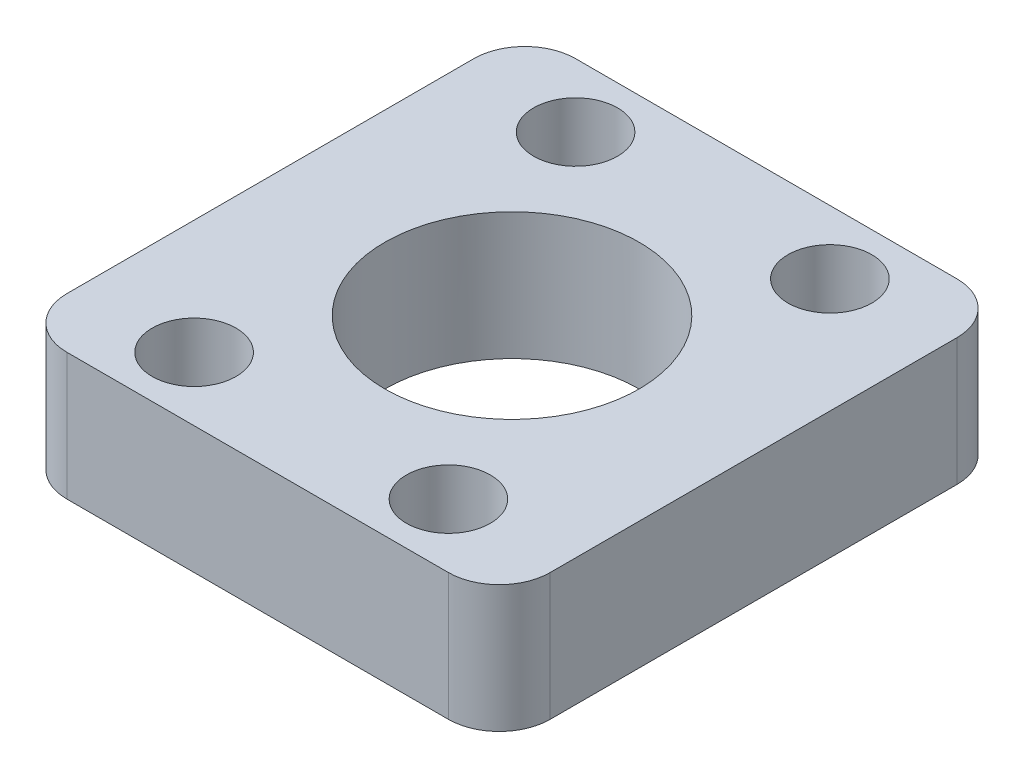
ISO-10303-21;
HEADER;
FILE_DESCRIPTION(('STEP AP214'),'2;1');
FILE_NAME('part.step','',(''),(''),'','','');
FILE_SCHEMA(('AUTOMOTIVE_DESIGN { 1 0 10303 214 1 1 1 1 }'));
ENDSEC;
DATA;
#1=APPLICATION_CONTEXT('core data for automotive mechanical design processes');
#2=APPLICATION_PROTOCOL_DEFINITION('international standard','automotive_design',2000,#1);
#3=PRODUCT_CONTEXT('',#1,'mechanical');
#4=PRODUCT('Part','Part','',(#3));
#5=PRODUCT_RELATED_PRODUCT_CATEGORY('part','',(#4));
#6=PRODUCT_DEFINITION_FORMATION('','',#4);
#7=PRODUCT_DEFINITION_CONTEXT('part definition',#1,'design');
#8=PRODUCT_DEFINITION('design','',#6,#7);
#9=PRODUCT_DEFINITION_SHAPE('','',#8);
#10=(LENGTH_UNIT() NAMED_UNIT(*) SI_UNIT(.MILLI.,.METRE.));
#11=(NAMED_UNIT(*) PLANE_ANGLE_UNIT() SI_UNIT($,.RADIAN.));
#12=(NAMED_UNIT(*) SI_UNIT($,.STERADIAN.) SOLID_ANGLE_UNIT());
#13=UNCERTAINTY_MEASURE_WITH_UNIT(LENGTH_MEASURE(1.E-05),#10,'distance_accuracy_value','');
#14=(GEOMETRIC_REPRESENTATION_CONTEXT(3) GLOBAL_UNCERTAINTY_ASSIGNED_CONTEXT((#13)) GLOBAL_UNIT_ASSIGNED_CONTEXT((#10,
#11,#12)) REPRESENTATION_CONTEXT('',''));
#15=CARTESIAN_POINT('',(0.,0.,0.));
#16=DIRECTION('',(0.,0.,1.));
#17=DIRECTION('',(1.,0.,0.));
#18=AXIS2_PLACEMENT_3D('',#15,#16,#17);
#19=CARTESIAN_POINT('',(9.5,5.,10.));
#20=DIRECTION('',(-1.,0.,0.));
#21=DIRECTION('',(0.,0.,1.));
#22=AXIS2_PLACEMENT_3D('',#19,#20,#21);
#23=PLANE('',#22);
#24=DIRECTION('',(0.,0.,-1.));
#25=VECTOR('',#24,1.);
#26=CARTESIAN_POINT('',(9.5,0.,10.));
#27=LINE('',#26,#25);
#28=CARTESIAN_POINT('',(9.5,0.,8.));
#29=VERTEX_POINT('',#28);
#30=CARTESIAN_POINT('',(9.5,0.,-8.));
#31=VERTEX_POINT('',#30);
#32=EDGE_CURVE('E136',#29,#31,#27,.T.);
#33=ORIENTED_EDGE('',*,*,#32,.T.);
#34=DIRECTION('',(0.,-1.,0.));
#35=VECTOR('',#34,1.);
#36=CARTESIAN_POINT('',(9.5,5.,-8.));
#37=LINE('',#36,#35);
#38=CARTESIAN_POINT('',(9.5,5.,-8.));
#39=VERTEX_POINT('',#38);
#40=EDGE_CURVE('E114',#31,#39,#37,.F.);
#41=ORIENTED_EDGE('',*,*,#40,.T.);
#42=DIRECTION('',(0.,0.,-1.));
#43=VECTOR('',#42,1.);
#44=CARTESIAN_POINT('',(9.5,5.,10.));
#45=LINE('',#44,#43);
#46=CARTESIAN_POINT('',(9.5,5.,8.));
#47=VERTEX_POINT('',#46);
#48=EDGE_CURVE('E145',#47,#39,#45,.T.);
#49=ORIENTED_EDGE('',*,*,#48,.F.);
#50=DIRECTION('',(0.,-1.,0.));
#51=VECTOR('',#50,1.);
#52=CARTESIAN_POINT('',(9.5,5.,8.));
#53=LINE('',#52,#51);
#54=EDGE_CURVE('E119',#47,#29,#53,.T.);
#55=ORIENTED_EDGE('',*,*,#54,.T.);
#56=EDGE_LOOP('',(#33,#41,#49,#55));
#57=FACE_BOUND('',#56,.T.);
#58=ADVANCED_FACE('F42',(#57),#23,.F.);
#59=CARTESIAN_POINT('',(-9.5,5.,-10.));
#60=DIRECTION('',(0.,0.,1.));
#61=DIRECTION('',(1.,0.,0.));
#62=AXIS2_PLACEMENT_3D('',#59,#60,#61);
#63=PLANE('',#62);
#64=DIRECTION('',(-1.,0.,0.));
#65=VECTOR('',#64,1.);
#66=CARTESIAN_POINT('',(-9.5,5.,-10.));
#67=LINE('',#66,#65);
#68=CARTESIAN_POINT('',(7.5,5.,-10.));
#69=VERTEX_POINT('',#68);
#70=CARTESIAN_POINT('',(-7.5,5.,-10.));
#71=VERTEX_POINT('',#70);
#72=EDGE_CURVE('E129',#69,#71,#67,.T.);
#73=ORIENTED_EDGE('',*,*,#72,.F.);
#74=DIRECTION('',(0.,-1.,0.));
#75=VECTOR('',#74,1.);
#76=CARTESIAN_POINT('',(7.5,5.,-10.));
#77=LINE('',#76,#75);
#78=CARTESIAN_POINT('',(7.5,0.,-10.));
#79=VERTEX_POINT('',#78);
#80=EDGE_CURVE('E113',#69,#79,#77,.T.);
#81=ORIENTED_EDGE('',*,*,#80,.T.);
#82=DIRECTION('',(-1.,0.,0.));
#83=VECTOR('',#82,1.);
#84=CARTESIAN_POINT('',(-9.5,0.,-10.));
#85=LINE('',#84,#83);
#86=CARTESIAN_POINT('',(-7.5,0.,-10.));
#87=VERTEX_POINT('',#86);
#88=EDGE_CURVE('E126',#79,#87,#85,.T.);
#89=ORIENTED_EDGE('',*,*,#88,.T.);
#90=DIRECTION('',(0.,-1.,0.));
#91=VECTOR('',#90,1.);
#92=CARTESIAN_POINT('',(-7.5,5.,-10.));
#93=LINE('',#92,#91);
#94=EDGE_CURVE('E131',#87,#71,#93,.F.);
#95=ORIENTED_EDGE('',*,*,#94,.T.);
#96=EDGE_LOOP('',(#73,#81,#89,#95));
#97=FACE_BOUND('',#96,.T.);
#98=ADVANCED_FACE('F125',(#97),#63,.F.);
#99=CARTESIAN_POINT('',(-9.5,5.,10.));
#100=DIRECTION('',(1.,0.,0.));
#101=DIRECTION('',(0.,0.,-1.));
#102=AXIS2_PLACEMENT_3D('',#99,#100,#101);
#103=PLANE('',#102);
#104=DIRECTION('',(0.,0.,1.));
#105=VECTOR('',#104,1.);
#106=CARTESIAN_POINT('',(-9.5,0.,10.));
#107=LINE('',#106,#105);
#108=CARTESIAN_POINT('',(-9.5,0.,-8.));
#109=VERTEX_POINT('',#108);
#110=CARTESIAN_POINT('',(-9.5,0.,8.));
#111=VERTEX_POINT('',#110);
#112=EDGE_CURVE('E135',#109,#111,#107,.T.);
#113=ORIENTED_EDGE('',*,*,#112,.T.);
#114=DIRECTION('',(0.,-1.,0.));
#115=VECTOR('',#114,1.);
#116=CARTESIAN_POINT('',(-9.5,5.,8.));
#117=LINE('',#116,#115);
#118=CARTESIAN_POINT('',(-9.5,5.,8.));
#119=VERTEX_POINT('',#118);
#120=EDGE_CURVE('E12',#111,#119,#117,.F.);
#121=ORIENTED_EDGE('',*,*,#120,.T.);
#122=DIRECTION('',(0.,0.,1.));
#123=VECTOR('',#122,1.);
#124=CARTESIAN_POINT('',(-9.5,5.,10.));
#125=LINE('',#124,#123);
#126=CARTESIAN_POINT('',(-9.5,5.,-8.));
#127=VERTEX_POINT('',#126);
#128=EDGE_CURVE('E172',#127,#119,#125,.T.);
#129=ORIENTED_EDGE('',*,*,#128,.F.);
#130=DIRECTION('',(0.,-1.,0.));
#131=VECTOR('',#130,1.);
#132=CARTESIAN_POINT('',(-9.5,5.,-8.));
#133=LINE('',#132,#131);
#134=EDGE_CURVE('E51',#127,#109,#133,.T.);
#135=ORIENTED_EDGE('',*,*,#134,.T.);
#136=EDGE_LOOP('',(#113,#121,#129,#135));
#137=FACE_BOUND('',#136,.T.);
#138=ADVANCED_FACE('F170',(#137),#103,.F.);
#139=CARTESIAN_POINT('',(-9.5,5.,10.));
#140=DIRECTION('',(0.,0.,-1.));
#141=DIRECTION('',(-1.,0.,0.));
#142=AXIS2_PLACEMENT_3D('',#139,#140,#141);
#143=PLANE('',#142);
#144=DIRECTION('',(1.,0.,0.));
#145=VECTOR('',#144,1.);
#146=CARTESIAN_POINT('',(-9.5,0.,10.));
#147=LINE('',#146,#145);
#148=CARTESIAN_POINT('',(-7.5,0.,10.));
#149=VERTEX_POINT('',#148);
#150=CARTESIAN_POINT('',(7.5,0.,10.));
#151=VERTEX_POINT('',#150);
#152=EDGE_CURVE('E139',#149,#151,#147,.T.);
#153=ORIENTED_EDGE('',*,*,#152,.T.);
#154=DIRECTION('',(0.,-1.,0.));
#155=VECTOR('',#154,1.);
#156=CARTESIAN_POINT('',(7.5,5.,10.));
#157=LINE('',#156,#155);
#158=CARTESIAN_POINT('',(7.5,5.,10.));
#159=VERTEX_POINT('',#158);
#160=EDGE_CURVE('E58',#151,#159,#157,.F.);
#161=ORIENTED_EDGE('',*,*,#160,.T.);
#162=DIRECTION('',(1.,0.,0.));
#163=VECTOR('',#162,1.);
#164=CARTESIAN_POINT('',(-9.5,5.,10.));
#165=LINE('',#164,#163);
#166=CARTESIAN_POINT('',(-7.5,5.,10.));
#167=VERTEX_POINT('',#166);
#168=EDGE_CURVE('E146',#167,#159,#165,.T.);
#169=ORIENTED_EDGE('',*,*,#168,.F.);
#170=DIRECTION('',(0.,-1.,0.));
#171=VECTOR('',#170,1.);
#172=CARTESIAN_POINT('',(-7.5,5.,10.));
#173=LINE('',#172,#171);
#174=EDGE_CURVE('E162',#167,#149,#173,.T.);
#175=ORIENTED_EDGE('',*,*,#174,.T.);
#176=EDGE_LOOP('',(#153,#161,#169,#175));
#177=FACE_BOUND('',#176,.T.);
#178=ADVANCED_FACE('F179',(#177),#143,.F.);
#179=CARTESIAN_POINT('',(0.,5.,0.));
#180=DIRECTION('',(0.,-1.,0.));
#181=DIRECTION('',(0.,0.,-1.));
#182=AXIS2_PLACEMENT_3D('',#179,#180,#181);
#183=PLANE('',#182);
#184=CARTESIAN_POINT('',(0.,5.,0.));
#185=DIRECTION('',(0.,1.,0.));
#186=DIRECTION('',(0.,0.,1.));
#187=AXIS2_PLACEMENT_3D('',#184,#185,#186);
#188=CIRCLE('',#187,5.);
#189=CARTESIAN_POINT('',(0.,5.,5.));
#190=VERTEX_POINT('',#189);
#191=EDGE_CURVE('E223',#190,#190,#188,.T.);
#192=ORIENTED_EDGE('',*,*,#191,.F.);
#193=EDGE_LOOP('',(#192));
#194=FACE_BOUND('',#193,.T.);
#195=CARTESIAN_POINT('',(-5.,5.,7.5));
#196=DIRECTION('',(0.,1.,0.));
#197=DIRECTION('',(0.,0.,-1.));
#198=AXIS2_PLACEMENT_3D('',#195,#196,#197);
#199=CIRCLE('',#198,1.65);
#200=CARTESIAN_POINT('',(-5.,5.,5.85));
#201=VERTEX_POINT('',#200);
#202=EDGE_CURVE('E201',#201,#201,#199,.T.);
#203=ORIENTED_EDGE('',*,*,#202,.F.);
#204=EDGE_LOOP('',(#203));
#205=FACE_BOUND('',#204,.T.);
#206=CARTESIAN_POINT('',(4.99999999999999,5.,7.5));
#207=DIRECTION('',(0.,1.,0.));
#208=DIRECTION('',(0.,0.,-1.));
#209=AXIS2_PLACEMENT_3D('',#206,#207,#208);
#210=CIRCLE('',#209,1.65);
#211=CARTESIAN_POINT('',(4.99999999999999,5.,5.85));
#212=VERTEX_POINT('',#211);
#213=EDGE_CURVE('E212',#212,#212,#210,.T.);
#214=ORIENTED_EDGE('',*,*,#213,.F.);
#215=EDGE_LOOP('',(#214));
#216=FACE_BOUND('',#215,.T.);
#217=CARTESIAN_POINT('',(5.,5.,-7.5));
#218=DIRECTION('',(0.,1.,0.));
#219=DIRECTION('',(0.,0.,1.));
#220=AXIS2_PLACEMENT_3D('',#217,#218,#219);
#221=CIRCLE('',#220,1.65);
#222=CARTESIAN_POINT('',(5.,5.,-5.85));
#223=VERTEX_POINT('',#222);
#224=EDGE_CURVE('E218',#223,#223,#221,.T.);
#225=ORIENTED_EDGE('',*,*,#224,.F.);
#226=EDGE_LOOP('',(#225));
#227=FACE_BOUND('',#226,.T.);
#228=CARTESIAN_POINT('',(-5.,5.,-7.5));
#229=DIRECTION('',(0.,1.,0.));
#230=DIRECTION('',(0.,0.,1.));
#231=AXIS2_PLACEMENT_3D('',#228,#229,#230);
#232=CIRCLE('',#231,1.65);
#233=CARTESIAN_POINT('',(-5.,5.,-5.85));
#234=VERTEX_POINT('',#233);
#235=EDGE_CURVE('E194',#234,#234,#232,.T.);
#236=ORIENTED_EDGE('',*,*,#235,.F.);
#237=EDGE_LOOP('',(#236));
#238=FACE_BOUND('',#237,.T.);
#239=ORIENTED_EDGE('',*,*,#48,.T.);
#240=CARTESIAN_POINT('',(7.5,5.,-8.));
#241=DIRECTION('',(0.,-1.,0.));
#242=DIRECTION('',(0.,0.,-1.));
#243=AXIS2_PLACEMENT_3D('',#240,#241,#242);
#244=CIRCLE('',#243,2.);
#245=EDGE_CURVE('E160',#39,#69,#244,.F.);
#246=ORIENTED_EDGE('',*,*,#245,.T.);
#247=ORIENTED_EDGE('',*,*,#72,.T.);
#248=CARTESIAN_POINT('',(-7.5,5.,-8.));
#249=DIRECTION('',(0.,-1.,0.));
#250=DIRECTION('',(0.,0.,-1.));
#251=AXIS2_PLACEMENT_3D('',#248,#249,#250);
#252=CIRCLE('',#251,2.);
#253=EDGE_CURVE('E155',#71,#127,#252,.F.);
#254=ORIENTED_EDGE('',*,*,#253,.T.);
#255=ORIENTED_EDGE('',*,*,#128,.T.);
#256=CARTESIAN_POINT('',(-7.5,5.,8.));
#257=DIRECTION('',(0.,-1.,0.));
#258=DIRECTION('',(0.,0.,-1.));
#259=AXIS2_PLACEMENT_3D('',#256,#257,#258);
#260=CIRCLE('',#259,2.);
#261=EDGE_CURVE('E65',#119,#167,#260,.F.);
#262=ORIENTED_EDGE('',*,*,#261,.T.);
#263=ORIENTED_EDGE('',*,*,#168,.T.);
#264=CARTESIAN_POINT('',(7.5,5.,8.));
#265=DIRECTION('',(0.,-1.,0.));
#266=DIRECTION('',(0.,0.,-1.));
#267=AXIS2_PLACEMENT_3D('',#264,#265,#266);
#268=CIRCLE('',#267,2.);
#269=EDGE_CURVE('E158',#159,#47,#268,.F.);
#270=ORIENTED_EDGE('',*,*,#269,.T.);
#271=EDGE_LOOP('',(#239,#246,#247,#254,#255,#262,#263,#270));
#272=FACE_BOUND('',#271,.T.);
#273=ADVANCED_FACE('F236',(#194,#205,#216,#227,#238,#272),#183,.F.);
#274=CARTESIAN_POINT('',(0.,0.,0.));
#275=DIRECTION('',(0.,-1.,0.));
#276=DIRECTION('',(0.,0.,-1.));
#277=AXIS2_PLACEMENT_3D('',#274,#275,#276);
#278=PLANE('',#277);
#279=CARTESIAN_POINT('',(0.,0.,0.));
#280=DIRECTION('',(0.,-1.,0.));
#281=DIRECTION('',(0.,0.,-1.));
#282=AXIS2_PLACEMENT_3D('',#279,#280,#281);
#283=CIRCLE('',#282,5.);
#284=CARTESIAN_POINT('',(0.,0.,-5.));
#285=VERTEX_POINT('',#284);
#286=EDGE_CURVE('E46',#285,#285,#283,.T.);
#287=ORIENTED_EDGE('',*,*,#286,.F.);
#288=EDGE_LOOP('',(#287));
#289=FACE_BOUND('',#288,.T.);
#290=CARTESIAN_POINT('',(-5.,0.,7.5));
#291=DIRECTION('',(0.,1.,0.));
#292=DIRECTION('',(0.,0.,-1.));
#293=AXIS2_PLACEMENT_3D('',#290,#291,#292);
#294=CIRCLE('',#293,1.65);
#295=CARTESIAN_POINT('',(-5.,0.,5.85));
#296=VERTEX_POINT('',#295);
#297=EDGE_CURVE('E205',#296,#296,#294,.T.);
#298=ORIENTED_EDGE('',*,*,#297,.T.);
#299=EDGE_LOOP('',(#298));
#300=FACE_BOUND('',#299,.T.);
#301=CARTESIAN_POINT('',(4.99999999999999,0.,7.5));
#302=DIRECTION('',(0.,1.,0.));
#303=DIRECTION('',(0.,0.,-1.));
#304=AXIS2_PLACEMENT_3D('',#301,#302,#303);
#305=CIRCLE('',#304,1.65);
#306=CARTESIAN_POINT('',(4.99999999999999,0.,5.85));
#307=VERTEX_POINT('',#306);
#308=EDGE_CURVE('E216',#307,#307,#305,.T.);
#309=ORIENTED_EDGE('',*,*,#308,.T.);
#310=EDGE_LOOP('',(#309));
#311=FACE_BOUND('',#310,.T.);
#312=CARTESIAN_POINT('',(5.,0.,-7.5));
#313=DIRECTION('',(0.,1.,0.));
#314=DIRECTION('',(0.,0.,1.));
#315=AXIS2_PLACEMENT_3D('',#312,#313,#314);
#316=CIRCLE('',#315,1.65);
#317=CARTESIAN_POINT('',(5.,0.,-5.85));
#318=VERTEX_POINT('',#317);
#319=EDGE_CURVE('E198',#318,#318,#316,.T.);
#320=ORIENTED_EDGE('',*,*,#319,.T.);
#321=EDGE_LOOP('',(#320));
#322=FACE_BOUND('',#321,.T.);
#323=CARTESIAN_POINT('',(-5.,0.,-7.5));
#324=DIRECTION('',(0.,1.,0.));
#325=DIRECTION('',(0.,0.,1.));
#326=AXIS2_PLACEMENT_3D('',#323,#324,#325);
#327=CIRCLE('',#326,1.65);
#328=CARTESIAN_POINT('',(-5.,0.,-5.85));
#329=VERTEX_POINT('',#328);
#330=EDGE_CURVE('E141',#329,#329,#327,.T.);
#331=ORIENTED_EDGE('',*,*,#330,.T.);
#332=EDGE_LOOP('',(#331));
#333=FACE_BOUND('',#332,.T.);
#334=ORIENTED_EDGE('',*,*,#88,.F.);
#335=CARTESIAN_POINT('',(7.5,0.,-8.));
#336=DIRECTION('',(0.,-1.,0.));
#337=DIRECTION('',(0.,0.,-1.));
#338=AXIS2_PLACEMENT_3D('',#335,#336,#337);
#339=CIRCLE('',#338,2.);
#340=EDGE_CURVE('E109',#79,#31,#339,.T.);
#341=ORIENTED_EDGE('',*,*,#340,.T.);
#342=ORIENTED_EDGE('',*,*,#32,.F.);
#343=CARTESIAN_POINT('',(7.5,0.,8.));
#344=DIRECTION('',(0.,-1.,0.));
#345=DIRECTION('',(0.,0.,-1.));
#346=AXIS2_PLACEMENT_3D('',#343,#344,#345);
#347=CIRCLE('',#346,2.);
#348=EDGE_CURVE('E120',#29,#151,#347,.T.);
#349=ORIENTED_EDGE('',*,*,#348,.T.);
#350=ORIENTED_EDGE('',*,*,#152,.F.);
#351=CARTESIAN_POINT('',(-7.5,0.,8.));
#352=DIRECTION('',(0.,-1.,0.));
#353=DIRECTION('',(0.,0.,-1.));
#354=AXIS2_PLACEMENT_3D('',#351,#352,#353);
#355=CIRCLE('',#354,2.);
#356=EDGE_CURVE('E149',#149,#111,#355,.T.);
#357=ORIENTED_EDGE('',*,*,#356,.T.);
#358=ORIENTED_EDGE('',*,*,#112,.F.);
#359=CARTESIAN_POINT('',(-7.5,0.,-8.));
#360=DIRECTION('',(0.,-1.,0.));
#361=DIRECTION('',(0.,0.,-1.));
#362=AXIS2_PLACEMENT_3D('',#359,#360,#361);
#363=CIRCLE('',#362,2.);
#364=EDGE_CURVE('E130',#109,#87,#363,.T.);
#365=ORIENTED_EDGE('',*,*,#364,.T.);
#366=EDGE_LOOP('',(#334,#341,#342,#349,#350,#357,#358,#365));
#367=FACE_BOUND('',#366,.T.);
#368=ADVANCED_FACE('F133',(#289,#300,#311,#322,#333,#367),#278,.T.);
#369=CARTESIAN_POINT('',(-5.,0.,-7.5));
#370=DIRECTION('',(0.,1.,0.));
#371=DIRECTION('',(0.,0.,1.));
#372=AXIS2_PLACEMENT_3D('',#369,#370,#371);
#373=CYLINDRICAL_SURFACE('',#372,1.65);
#374=ORIENTED_EDGE('',*,*,#330,.F.);
#375=EDGE_LOOP('',(#374));
#376=FACE_BOUND('',#375,.T.);
#377=ORIENTED_EDGE('',*,*,#235,.T.);
#378=EDGE_LOOP('',(#377));
#379=FACE_BOUND('',#378,.T.);
#380=ADVANCED_FACE('F235',(#376,#379),#373,.F.);
#381=CARTESIAN_POINT('',(5.,0.,-7.5));
#382=DIRECTION('',(0.,1.,0.));
#383=DIRECTION('',(0.,0.,1.));
#384=AXIS2_PLACEMENT_3D('',#381,#382,#383);
#385=CYLINDRICAL_SURFACE('',#384,1.65);
#386=ORIENTED_EDGE('',*,*,#319,.F.);
#387=EDGE_LOOP('',(#386));
#388=FACE_BOUND('',#387,.T.);
#389=ORIENTED_EDGE('',*,*,#224,.T.);
#390=EDGE_LOOP('',(#389));
#391=FACE_BOUND('',#390,.T.);
#392=ADVANCED_FACE('F249',(#388,#391),#385,.F.);
#393=CARTESIAN_POINT('',(4.99999999999999,0.,7.5));
#394=DIRECTION('',(0.,1.,0.));
#395=DIRECTION('',(0.,0.,1.));
#396=AXIS2_PLACEMENT_3D('',#393,#394,#395);
#397=CYLINDRICAL_SURFACE('',#396,1.65);
#398=ORIENTED_EDGE('',*,*,#308,.F.);
#399=EDGE_LOOP('',(#398));
#400=FACE_BOUND('',#399,.T.);
#401=ORIENTED_EDGE('',*,*,#213,.T.);
#402=EDGE_LOOP('',(#401));
#403=FACE_BOUND('',#402,.T.);
#404=ADVANCED_FACE('F282',(#400,#403),#397,.F.);
#405=CARTESIAN_POINT('',(-5.,0.,7.5));
#406=DIRECTION('',(0.,1.,0.));
#407=DIRECTION('',(0.,0.,1.));
#408=AXIS2_PLACEMENT_3D('',#405,#406,#407);
#409=CYLINDRICAL_SURFACE('',#408,1.65);
#410=ORIENTED_EDGE('',*,*,#297,.F.);
#411=EDGE_LOOP('',(#410));
#412=FACE_BOUND('',#411,.T.);
#413=ORIENTED_EDGE('',*,*,#202,.T.);
#414=EDGE_LOOP('',(#413));
#415=FACE_BOUND('',#414,.T.);
#416=ADVANCED_FACE('F267',(#412,#415),#409,.F.);
#417=CARTESIAN_POINT('',(7.5,5.,-8.));
#418=DIRECTION('',(0.,-1.,0.));
#419=DIRECTION('',(0.,0.,-1.));
#420=AXIS2_PLACEMENT_3D('',#417,#418,#419);
#421=CYLINDRICAL_SURFACE('',#420,2.);
#422=ORIENTED_EDGE('',*,*,#245,.F.);
#423=ORIENTED_EDGE('',*,*,#40,.F.);
#424=ORIENTED_EDGE('',*,*,#340,.F.);
#425=ORIENTED_EDGE('',*,*,#80,.F.);
#426=EDGE_LOOP('',(#422,#423,#424,#425));
#427=FACE_BOUND('',#426,.T.);
#428=ADVANCED_FACE('F112',(#427),#421,.T.);
#429=CARTESIAN_POINT('',(7.5,5.,8.));
#430=DIRECTION('',(0.,-1.,0.));
#431=DIRECTION('',(0.,0.,-1.));
#432=AXIS2_PLACEMENT_3D('',#429,#430,#431);
#433=CYLINDRICAL_SURFACE('',#432,2.);
#434=ORIENTED_EDGE('',*,*,#269,.F.);
#435=ORIENTED_EDGE('',*,*,#160,.F.);
#436=ORIENTED_EDGE('',*,*,#348,.F.);
#437=ORIENTED_EDGE('',*,*,#54,.F.);
#438=EDGE_LOOP('',(#434,#435,#436,#437));
#439=FACE_BOUND('',#438,.T.);
#440=ADVANCED_FACE('F260',(#439),#433,.T.);
#441=CARTESIAN_POINT('',(-7.5,5.,8.));
#442=DIRECTION('',(0.,-1.,0.));
#443=DIRECTION('',(0.,0.,-1.));
#444=AXIS2_PLACEMENT_3D('',#441,#442,#443);
#445=CYLINDRICAL_SURFACE('',#444,2.);
#446=ORIENTED_EDGE('',*,*,#261,.F.);
#447=ORIENTED_EDGE('',*,*,#120,.F.);
#448=ORIENTED_EDGE('',*,*,#356,.F.);
#449=ORIENTED_EDGE('',*,*,#174,.F.);
#450=EDGE_LOOP('',(#446,#447,#448,#449));
#451=FACE_BOUND('',#450,.T.);
#452=ADVANCED_FACE('F178',(#451),#445,.T.);
#453=CARTESIAN_POINT('',(-7.5,5.,-8.));
#454=DIRECTION('',(0.,-1.,0.));
#455=DIRECTION('',(0.,0.,-1.));
#456=AXIS2_PLACEMENT_3D('',#453,#454,#455);
#457=CYLINDRICAL_SURFACE('',#456,2.);
#458=ORIENTED_EDGE('',*,*,#253,.F.);
#459=ORIENTED_EDGE('',*,*,#94,.F.);
#460=ORIENTED_EDGE('',*,*,#364,.F.);
#461=ORIENTED_EDGE('',*,*,#134,.F.);
#462=EDGE_LOOP('',(#458,#459,#460,#461));
#463=FACE_BOUND('',#462,.T.);
#464=ADVANCED_FACE('F44',(#463),#457,.T.);
#465=CARTESIAN_POINT('',(0.,-5.,0.));
#466=DIRECTION('',(0.,1.,0.));
#467=DIRECTION('',(0.,0.,1.));
#468=AXIS2_PLACEMENT_3D('',#465,#466,#467);
#469=CYLINDRICAL_SURFACE('',#468,5.);
#470=ORIENTED_EDGE('',*,*,#286,.T.);
#471=EDGE_LOOP('',(#470));
#472=FACE_BOUND('',#471,.T.);
#473=ORIENTED_EDGE('',*,*,#191,.T.);
#474=EDGE_LOOP('',(#473));
#475=FACE_BOUND('',#474,.T.);
#476=ADVANCED_FACE('F231',(#472,#475),#469,.F.);
#477=CLOSED_SHELL('',(#58,#98,#138,#178,#273,#368,#380,#392,#404,#416,#428,#440,#452,#464,#476));
#478=MANIFOLD_SOLID_BREP('B2',#477);
#479=ADVANCED_BREP_SHAPE_REPRESENTATION('',(#18,#478),#14);
#480=SHAPE_DEFINITION_REPRESENTATION(#9,#479);
ENDSEC;
END-ISO-10303-21;
